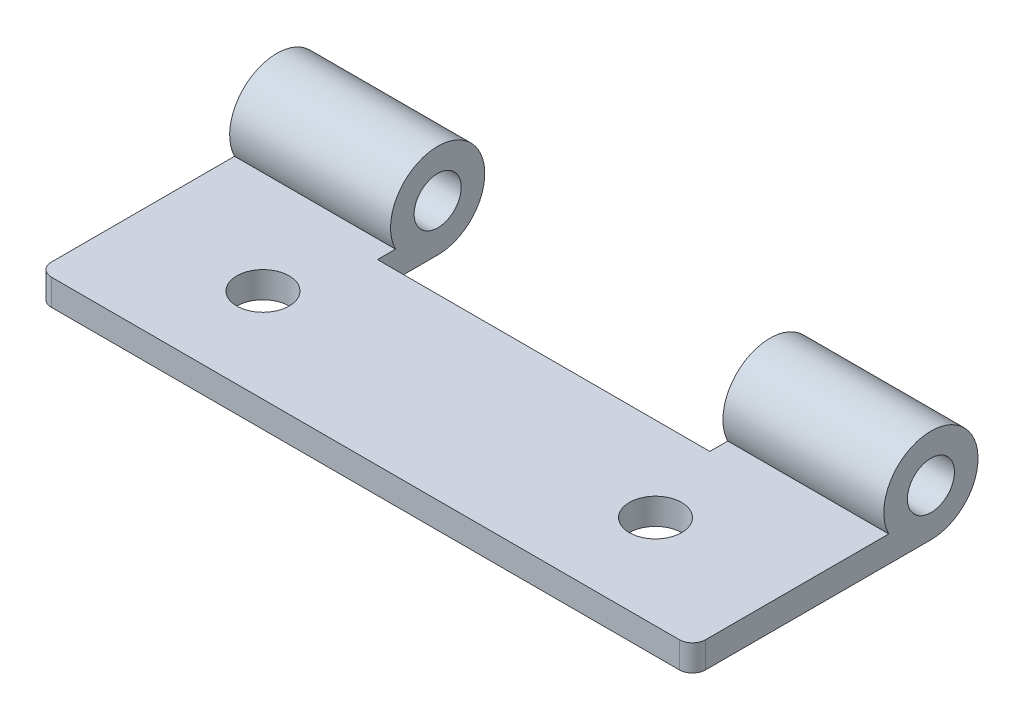
ISO-10303-21;
HEADER;
FILE_DESCRIPTION(('STEP AP214'),'2;1');
FILE_NAME('part.step','',(''),(''),'','','');
FILE_SCHEMA(('AUTOMOTIVE_DESIGN { 1 0 10303 214 1 1 1 1 }'));
ENDSEC;
DATA;
#1=APPLICATION_CONTEXT('core data for automotive mechanical design processes');
#2=APPLICATION_PROTOCOL_DEFINITION('international standard','automotive_design',2000,#1);
#3=PRODUCT_CONTEXT('',#1,'mechanical');
#4=PRODUCT('Part','Part','',(#3));
#5=PRODUCT_RELATED_PRODUCT_CATEGORY('part','',(#4));
#6=PRODUCT_DEFINITION_FORMATION('','',#4);
#7=PRODUCT_DEFINITION_CONTEXT('part definition',#1,'design');
#8=PRODUCT_DEFINITION('design','',#6,#7);
#9=PRODUCT_DEFINITION_SHAPE('','',#8);
#10=(LENGTH_UNIT() NAMED_UNIT(*) SI_UNIT(.MILLI.,.METRE.));
#11=(NAMED_UNIT(*) PLANE_ANGLE_UNIT() SI_UNIT($,.RADIAN.));
#12=(NAMED_UNIT(*) SI_UNIT($,.STERADIAN.) SOLID_ANGLE_UNIT());
#13=UNCERTAINTY_MEASURE_WITH_UNIT(LENGTH_MEASURE(1.E-05),#10,'distance_accuracy_value','');
#14=(GEOMETRIC_REPRESENTATION_CONTEXT(3) GLOBAL_UNCERTAINTY_ASSIGNED_CONTEXT((#13)) GLOBAL_UNIT_ASSIGNED_CONTEXT((#10,
#11,#12)) REPRESENTATION_CONTEXT('',''));
#15=CARTESIAN_POINT('',(0.,0.,0.));
#16=DIRECTION('',(0.,0.,1.));
#17=DIRECTION('',(1.,0.,0.));
#18=AXIS2_PLACEMENT_3D('',#15,#16,#17);
#19=CARTESIAN_POINT('',(25.,-0.800000000000001,9.11245154965971));
#20=DIRECTION('',(0.,-1.,0.));
#21=DIRECTION('',(0.,0.,-1.));
#22=AXIS2_PLACEMENT_3D('',#19,#20,#21);
#23=PLANE('',#22);
#24=CARTESIAN_POINT('',(20.,-0.800000000000002,5.52599178161175));
#25=DIRECTION('',(0.,-1.,0.));
#26=DIRECTION('',(0.,0.,-1.));
#27=AXIS2_PLACEMENT_3D('',#24,#25,#26);
#28=CIRCLE('',#27,0.999999999999998);
#29=CARTESIAN_POINT('',(20.,-0.800000000000002,4.52599178161175));
#30=VERTEX_POINT('',#29);
#31=EDGE_CURVE('E208',#30,#30,#28,.T.);
#32=ORIENTED_EDGE('',*,*,#31,.T.);
#33=EDGE_LOOP('',(#32));
#34=FACE_BOUND('',#33,.T.);
#35=DIRECTION('',(0.,0.,1.));
#36=VECTOR('',#35,1.);
#37=CARTESIAN_POINT('',(0.,-0.800000000000001,9.11245154965971));
#38=LINE('',#37,#36);
#39=CARTESIAN_POINT('',(0.,-0.800000000000001,1.61245154965971));
#40=VERTEX_POINT('',#39);
#41=CARTESIAN_POINT('',(0.,-0.800000000000001,8.61245154965971));
#42=VERTEX_POINT('',#41);
#43=EDGE_CURVE('E169',#40,#42,#38,.T.);
#44=ORIENTED_EDGE('',*,*,#43,.T.);
#45=CARTESIAN_POINT('',(0.5,-0.800000000000001,8.61245154965971));
#46=DIRECTION('',(0.,-1.,0.));
#47=DIRECTION('',(0.,0.,-1.));
#48=AXIS2_PLACEMENT_3D('',#45,#46,#47);
#49=CIRCLE('',#48,0.5);
#50=CARTESIAN_POINT('',(0.5,-0.800000000000001,9.11245154965971));
#51=VERTEX_POINT('',#50);
#52=EDGE_CURVE('E54',#42,#51,#49,.F.);
#53=ORIENTED_EDGE('',*,*,#52,.T.);
#54=DIRECTION('',(-1.,0.,0.));
#55=VECTOR('',#54,1.);
#56=CARTESIAN_POINT('',(25.,-0.800000000000001,9.11245154965971));
#57=LINE('',#56,#55);
#58=CARTESIAN_POINT('',(24.5,-0.800000000000001,9.11245154965971));
#59=VERTEX_POINT('',#58);
#60=EDGE_CURVE('E178',#59,#51,#57,.T.);
#61=ORIENTED_EDGE('',*,*,#60,.F.);
#62=CARTESIAN_POINT('',(24.5,-0.800000000000001,8.61245154965971));
#63=DIRECTION('',(0.,-1.,0.));
#64=DIRECTION('',(0.,0.,-1.));
#65=AXIS2_PLACEMENT_3D('',#62,#63,#64);
#66=CIRCLE('',#65,0.5);
#67=CARTESIAN_POINT('',(25.,-0.800000000000001,8.61245154965971));
#68=VERTEX_POINT('',#67);
#69=EDGE_CURVE('E62',#59,#68,#66,.F.);
#70=ORIENTED_EDGE('',*,*,#69,.T.);
#71=DIRECTION('',(0.,0.,1.));
#72=VECTOR('',#71,1.);
#73=CARTESIAN_POINT('',(25.,-0.800000000000001,9.11245154965971));
#74=LINE('',#73,#72);
#75=CARTESIAN_POINT('',(25.,-0.800000000000001,1.61245154965971));
#76=VERTEX_POINT('',#75);
#77=EDGE_CURVE('E161',#76,#68,#74,.T.);
#78=ORIENTED_EDGE('',*,*,#77,.F.);
#79=DIRECTION('',(-1.,0.,0.));
#80=VECTOR('',#79,1.);
#81=CARTESIAN_POINT('',(25.,-0.800000000000001,1.61245154965971));
#82=LINE('',#81,#80);
#83=CARTESIAN_POINT('',(18.85,-0.800000000000001,1.61245154965971));
#84=VERTEX_POINT('',#83);
#85=EDGE_CURVE('E182',#76,#84,#82,.T.);
#86=ORIENTED_EDGE('',*,*,#85,.T.);
#87=DIRECTION('',(0.,0.,1.));
#88=VECTOR('',#87,1.);
#89=CARTESIAN_POINT('',(18.85,-0.800000000000001,9.11245154965971));
#90=LINE('',#89,#88);
#91=CARTESIAN_POINT('',(18.85,-0.800000000000002,2.3));
#92=VERTEX_POINT('',#91);
#93=EDGE_CURVE('E149',#84,#92,#90,.T.);
#94=ORIENTED_EDGE('',*,*,#93,.T.);
#95=DIRECTION('',(1.,0.,0.));
#96=VECTOR('',#95,1.);
#97=CARTESIAN_POINT('',(25.,-0.800000000000001,2.3));
#98=LINE('',#97,#96);
#99=CARTESIAN_POINT('',(6.15,-0.800000000000002,2.3));
#100=VERTEX_POINT('',#99);
#101=EDGE_CURVE('E140',#100,#92,#98,.T.);
#102=ORIENTED_EDGE('',*,*,#101,.F.);
#103=DIRECTION('',(0.,0.,1.));
#104=VECTOR('',#103,1.);
#105=CARTESIAN_POINT('',(6.15,-0.800000000000001,9.11245154965971));
#106=LINE('',#105,#104);
#107=CARTESIAN_POINT('',(6.15,-0.800000000000001,1.61245154965971));
#108=VERTEX_POINT('',#107);
#109=EDGE_CURVE('E127',#108,#100,#106,.T.);
#110=ORIENTED_EDGE('',*,*,#109,.F.);
#111=EDGE_CURVE('E181',#108,#40,#82,.T.);
#112=ORIENTED_EDGE('',*,*,#111,.T.);
#113=EDGE_LOOP('',(#44,#53,#61,#70,#78,#86,#94,#102,#110,#112));
#114=FACE_BOUND('',#113,.T.);
#115=CARTESIAN_POINT('',(5.,-0.800000000000002,5.52599178161175));
#116=DIRECTION('',(0.,-1.,0.));
#117=DIRECTION('',(0.,0.,-1.));
#118=AXIS2_PLACEMENT_3D('',#115,#116,#117);
#119=CIRCLE('',#118,1.);
#120=CARTESIAN_POINT('',(5.,-0.800000000000002,4.52599178161175));
#121=VERTEX_POINT('',#120);
#122=EDGE_CURVE('E216',#121,#121,#119,.F.);
#123=ORIENTED_EDGE('',*,*,#122,.F.);
#124=EDGE_LOOP('',(#123));
#125=FACE_BOUND('',#124,.T.);
#126=ADVANCED_FACE('F45',(#34,#114,#125),#23,.F.);
#127=CARTESIAN_POINT('',(25.,-1.8,0.));
#128=DIRECTION('',(0.,1.,0.));
#129=DIRECTION('',(0.,0.,1.));
#130=AXIS2_PLACEMENT_3D('',#127,#128,#129);
#131=PLANE('',#130);
#132=CARTESIAN_POINT('',(20.,-1.8,5.52599178161175));
#133=DIRECTION('',(0.,1.,0.));
#134=DIRECTION('',(0.,0.,1.));
#135=AXIS2_PLACEMENT_3D('',#132,#133,#134);
#136=CIRCLE('',#135,0.999999999999998);
#137=CARTESIAN_POINT('',(20.,-1.8,6.52599178161175));
#138=VERTEX_POINT('',#137);
#139=EDGE_CURVE('E206',#138,#138,#136,.T.);
#140=ORIENTED_EDGE('',*,*,#139,.T.);
#141=EDGE_LOOP('',(#140));
#142=FACE_BOUND('',#141,.T.);
#143=DIRECTION('',(-1.,0.,0.));
#144=VECTOR('',#143,1.);
#145=CARTESIAN_POINT('',(25.,-1.8,9.11245154965971));
#146=LINE('',#145,#144);
#147=CARTESIAN_POINT('',(24.5,-1.8,9.11245154965971));
#148=VERTEX_POINT('',#147);
#149=CARTESIAN_POINT('',(0.5,-1.8,9.11245154965971));
#150=VERTEX_POINT('',#149);
#151=EDGE_CURVE('E175',#148,#150,#146,.T.);
#152=ORIENTED_EDGE('',*,*,#151,.T.);
#153=CARTESIAN_POINT('',(0.5,-1.8,8.61245154965971));
#154=DIRECTION('',(0.,1.,0.));
#155=DIRECTION('',(0.,0.,1.));
#156=AXIS2_PLACEMENT_3D('',#153,#154,#155);
#157=CIRCLE('',#156,0.5);
#158=CARTESIAN_POINT('',(0.,-1.8,8.61245154965971));
#159=VERTEX_POINT('',#158);
#160=EDGE_CURVE('E202',#150,#159,#157,.F.);
#161=ORIENTED_EDGE('',*,*,#160,.T.);
#162=DIRECTION('',(0.,0.,-1.));
#163=VECTOR('',#162,1.);
#164=CARTESIAN_POINT('',(0.,-1.8,0.));
#165=LINE('',#164,#163);
#166=CARTESIAN_POINT('',(0.,-1.8,0.));
#167=VERTEX_POINT('',#166);
#168=EDGE_CURVE('E162',#159,#167,#165,.T.);
#169=ORIENTED_EDGE('',*,*,#168,.T.);
#170=DIRECTION('',(-1.,0.,0.));
#171=VECTOR('',#170,1.);
#172=CARTESIAN_POINT('',(25.,-1.8,0.));
#173=LINE('',#172,#171);
#174=CARTESIAN_POINT('',(6.15,-1.8,0.));
#175=VERTEX_POINT('',#174);
#176=EDGE_CURVE('E166',#175,#167,#173,.T.);
#177=ORIENTED_EDGE('',*,*,#176,.F.);
#178=DIRECTION('',(0.,0.,-1.));
#179=VECTOR('',#178,1.);
#180=CARTESIAN_POINT('',(6.15,-1.8,0.));
#181=LINE('',#180,#179);
#182=CARTESIAN_POINT('',(6.15,-1.8,2.3));
#183=VERTEX_POINT('',#182);
#184=EDGE_CURVE('E185',#183,#175,#181,.T.);
#185=ORIENTED_EDGE('',*,*,#184,.F.);
#186=DIRECTION('',(-1.,0.,0.));
#187=VECTOR('',#186,1.);
#188=CARTESIAN_POINT('',(25.,-1.8,2.3));
#189=LINE('',#188,#187);
#190=CARTESIAN_POINT('',(18.85,-1.8,2.3));
#191=VERTEX_POINT('',#190);
#192=EDGE_CURVE('E143',#191,#183,#189,.T.);
#193=ORIENTED_EDGE('',*,*,#192,.F.);
#194=DIRECTION('',(0.,0.,-1.));
#195=VECTOR('',#194,1.);
#196=CARTESIAN_POINT('',(18.85,-1.8,0.));
#197=LINE('',#196,#195);
#198=CARTESIAN_POINT('',(18.85,-1.8,0.));
#199=VERTEX_POINT('',#198);
#200=EDGE_CURVE('E187',#191,#199,#197,.T.);
#201=ORIENTED_EDGE('',*,*,#200,.T.);
#202=CARTESIAN_POINT('',(25.,-1.8,0.));
#203=VERTEX_POINT('',#202);
#204=EDGE_CURVE('E172',#203,#199,#173,.T.);
#205=ORIENTED_EDGE('',*,*,#204,.F.);
#206=DIRECTION('',(0.,0.,-1.));
#207=VECTOR('',#206,1.);
#208=CARTESIAN_POINT('',(25.,-1.8,0.));
#209=LINE('',#208,#207);
#210=CARTESIAN_POINT('',(25.,-1.8,8.61245154965971));
#211=VERTEX_POINT('',#210);
#212=EDGE_CURVE('E164',#211,#203,#209,.T.);
#213=ORIENTED_EDGE('',*,*,#212,.F.);
#214=CARTESIAN_POINT('',(24.5,-1.8,8.61245154965971));
#215=DIRECTION('',(0.,1.,0.));
#216=DIRECTION('',(0.,0.,1.));
#217=AXIS2_PLACEMENT_3D('',#214,#215,#216);
#218=CIRCLE('',#217,0.5);
#219=EDGE_CURVE('E200',#211,#148,#218,.F.);
#220=ORIENTED_EDGE('',*,*,#219,.T.);
#221=EDGE_LOOP('',(#152,#161,#169,#177,#185,#193,#201,#205,#213,#220));
#222=FACE_BOUND('',#221,.T.);
#223=CARTESIAN_POINT('',(5.,-1.8,5.52599178161175));
#224=DIRECTION('',(0.,1.,0.));
#225=DIRECTION('',(0.,0.,1.));
#226=AXIS2_PLACEMENT_3D('',#223,#224,#225);
#227=CIRCLE('',#226,1.);
#228=CARTESIAN_POINT('',(5.,-1.8,6.52599178161175));
#229=VERTEX_POINT('',#228);
#230=EDGE_CURVE('E49',#229,#229,#227,.F.);
#231=ORIENTED_EDGE('',*,*,#230,.F.);
#232=EDGE_LOOP('',(#231));
#233=FACE_BOUND('',#232,.T.);
#234=ADVANCED_FACE('F231',(#142,#222,#233),#131,.F.);
#235=CARTESIAN_POINT('',(25.,0.,0.));
#236=DIRECTION('',(-1.,0.,0.));
#237=DIRECTION('',(0.,0.,1.));
#238=AXIS2_PLACEMENT_3D('',#235,#236,#237);
#239=CYLINDRICAL_SURFACE('',#238,1.8);
#240=CARTESIAN_POINT('',(6.15,0.,0.));
#241=DIRECTION('',(1.,0.,0.));
#242=DIRECTION('',(0.,0.,-1.));
#243=AXIS2_PLACEMENT_3D('',#240,#241,#242);
#244=CIRCLE('',#243,1.8);
#245=EDGE_CURVE('E133',#175,#108,#244,.T.);
#246=ORIENTED_EDGE('',*,*,#245,.F.);
#247=ORIENTED_EDGE('',*,*,#176,.T.);
#248=CARTESIAN_POINT('',(0.,0.,0.));
#249=DIRECTION('',(1.,0.,0.));
#250=DIRECTION('',(0.,0.,-1.));
#251=AXIS2_PLACEMENT_3D('',#248,#249,#250);
#252=CIRCLE('',#251,1.8);
#253=EDGE_CURVE('E157',#167,#40,#252,.T.);
#254=ORIENTED_EDGE('',*,*,#253,.T.);
#255=ORIENTED_EDGE('',*,*,#111,.F.);
#256=EDGE_LOOP('',(#246,#247,#254,#255));
#257=FACE_BOUND('',#256,.T.);
#258=ADVANCED_FACE('F236',(#257),#239,.T.);
#259=ORIENTED_EDGE('',*,*,#204,.T.);
#260=CARTESIAN_POINT('',(18.85,0.,0.));
#261=DIRECTION('',(1.,0.,0.));
#262=DIRECTION('',(0.,0.,-1.));
#263=AXIS2_PLACEMENT_3D('',#260,#261,#262);
#264=CIRCLE('',#263,1.8);
#265=EDGE_CURVE('E136',#199,#84,#264,.T.);
#266=ORIENTED_EDGE('',*,*,#265,.T.);
#267=ORIENTED_EDGE('',*,*,#85,.F.);
#268=CARTESIAN_POINT('',(25.,0.,0.));
#269=DIRECTION('',(1.,0.,0.));
#270=DIRECTION('',(0.,0.,-1.));
#271=AXIS2_PLACEMENT_3D('',#268,#269,#270);
#272=CIRCLE('',#271,1.8);
#273=EDGE_CURVE('E158',#203,#76,#272,.T.);
#274=ORIENTED_EDGE('',*,*,#273,.F.);
#275=EDGE_LOOP('',(#259,#266,#267,#274));
#276=FACE_BOUND('',#275,.T.);
#277=ADVANCED_FACE('F255',(#276),#239,.T.);
#278=CARTESIAN_POINT('',(25.,-1.8,9.11245154965971));
#279=DIRECTION('',(0.,0.,-1.));
#280=DIRECTION('',(-1.,0.,0.));
#281=AXIS2_PLACEMENT_3D('',#278,#279,#280);
#282=PLANE('',#281);
#283=ORIENTED_EDGE('',*,*,#60,.T.);
#284=DIRECTION('',(0.,-1.,0.));
#285=VECTOR('',#284,1.);
#286=CARTESIAN_POINT('',(0.5,-1.8,9.11245154965971));
#287=LINE('',#286,#285);
#288=EDGE_CURVE('E197',#51,#150,#287,.T.);
#289=ORIENTED_EDGE('',*,*,#288,.T.);
#290=ORIENTED_EDGE('',*,*,#151,.F.);
#291=DIRECTION('',(0.,-1.,0.));
#292=VECTOR('',#291,1.);
#293=CARTESIAN_POINT('',(24.5,-0.800000000000001,9.11245154965971));
#294=LINE('',#293,#292);
#295=EDGE_CURVE('E190',#148,#59,#294,.F.);
#296=ORIENTED_EDGE('',*,*,#295,.T.);
#297=EDGE_LOOP('',(#283,#289,#290,#296));
#298=FACE_BOUND('',#297,.T.);
#299=ADVANCED_FACE('F244',(#298),#282,.F.);
#300=CARTESIAN_POINT('',(25.,0.,0.));
#301=DIRECTION('',(1.,0.,0.));
#302=DIRECTION('',(0.,0.,-1.));
#303=AXIS2_PLACEMENT_3D('',#300,#301,#302);
#304=PLANE('',#303);
#305=CARTESIAN_POINT('',(25.,0.,0.));
#306=DIRECTION('',(1.,0.,0.));
#307=DIRECTION('',(0.,0.,-1.));
#308=AXIS2_PLACEMENT_3D('',#305,#306,#307);
#309=CIRCLE('',#308,0.9);
#310=CARTESIAN_POINT('',(25.,0.,-0.9));
#311=VERTEX_POINT('',#310);
#312=EDGE_CURVE('E220',#311,#311,#309,.T.);
#313=ORIENTED_EDGE('',*,*,#312,.F.);
#314=EDGE_LOOP('',(#313));
#315=FACE_BOUND('',#314,.T.);
#316=ORIENTED_EDGE('',*,*,#77,.T.);
#317=DIRECTION('',(0.,-1.,0.));
#318=VECTOR('',#317,1.);
#319=CARTESIAN_POINT('',(25.,-1.8,8.61245154965971));
#320=LINE('',#319,#318);
#321=EDGE_CURVE('E11',#68,#211,#320,.T.);
#322=ORIENTED_EDGE('',*,*,#321,.T.);
#323=ORIENTED_EDGE('',*,*,#212,.T.);
#324=ORIENTED_EDGE('',*,*,#273,.T.);
#325=EDGE_LOOP('',(#316,#322,#323,#324));
#326=FACE_BOUND('',#325,.T.);
#327=ADVANCED_FACE('F251',(#315,#326),#304,.T.);
#328=CARTESIAN_POINT('',(0.,0.,0.));
#329=DIRECTION('',(1.,0.,0.));
#330=DIRECTION('',(0.,0.,-1.));
#331=AXIS2_PLACEMENT_3D('',#328,#329,#330);
#332=PLANE('',#331);
#333=CARTESIAN_POINT('',(0.,0.,0.));
#334=DIRECTION('',(1.,0.,0.));
#335=DIRECTION('',(0.,0.,-1.));
#336=AXIS2_PLACEMENT_3D('',#333,#334,#335);
#337=CIRCLE('',#336,0.9);
#338=CARTESIAN_POINT('',(0.,0.,-0.9));
#339=VERTEX_POINT('',#338);
#340=EDGE_CURVE('E195',#339,#339,#337,.T.);
#341=ORIENTED_EDGE('',*,*,#340,.T.);
#342=EDGE_LOOP('',(#341));
#343=FACE_BOUND('',#342,.T.);
#344=ORIENTED_EDGE('',*,*,#168,.F.);
#345=DIRECTION('',(0.,-1.,0.));
#346=VECTOR('',#345,1.);
#347=CARTESIAN_POINT('',(0.,0.,8.61245154965971));
#348=LINE('',#347,#346);
#349=EDGE_CURVE('E70',#159,#42,#348,.F.);
#350=ORIENTED_EDGE('',*,*,#349,.T.);
#351=ORIENTED_EDGE('',*,*,#43,.F.);
#352=ORIENTED_EDGE('',*,*,#253,.F.);
#353=EDGE_LOOP('',(#344,#350,#351,#352));
#354=FACE_BOUND('',#353,.T.);
#355=ADVANCED_FACE('F239',(#343,#354),#332,.F.);
#356=CARTESIAN_POINT('',(18.85,25.,0.));
#357=DIRECTION('',(1.,0.,0.));
#358=DIRECTION('',(0.,0.,-1.));
#359=AXIS2_PLACEMENT_3D('',#356,#357,#358);
#360=PLANE('',#359);
#361=CARTESIAN_POINT('',(18.85,0.,0.));
#362=DIRECTION('',(1.,0.,0.));
#363=DIRECTION('',(0.,0.,-1.));
#364=AXIS2_PLACEMENT_3D('',#361,#362,#363);
#365=CIRCLE('',#364,0.9);
#366=CARTESIAN_POINT('',(18.85,0.,-0.9));
#367=VERTEX_POINT('',#366);
#368=EDGE_CURVE('E194',#367,#367,#365,.T.);
#369=ORIENTED_EDGE('',*,*,#368,.T.);
#370=EDGE_LOOP('',(#369));
#371=FACE_BOUND('',#370,.T.);
#372=ORIENTED_EDGE('',*,*,#265,.F.);
#373=ORIENTED_EDGE('',*,*,#200,.F.);
#374=DIRECTION('',(0.,-1.,0.));
#375=VECTOR('',#374,1.);
#376=CARTESIAN_POINT('',(18.85,25.,2.3));
#377=LINE('',#376,#375);
#378=EDGE_CURVE('E144',#92,#191,#377,.T.);
#379=ORIENTED_EDGE('',*,*,#378,.F.);
#380=ORIENTED_EDGE('',*,*,#93,.F.);
#381=EDGE_LOOP('',(#372,#373,#379,#380));
#382=FACE_BOUND('',#381,.T.);
#383=ADVANCED_FACE('F228',(#371,#382),#360,.F.);
#384=CARTESIAN_POINT('',(6.15,25.,0.));
#385=DIRECTION('',(1.,0.,0.));
#386=DIRECTION('',(0.,0.,-1.));
#387=AXIS2_PLACEMENT_3D('',#384,#385,#386);
#388=PLANE('',#387);
#389=CARTESIAN_POINT('',(6.15,0.,0.));
#390=DIRECTION('',(1.,0.,0.));
#391=DIRECTION('',(0.,0.,-1.));
#392=AXIS2_PLACEMENT_3D('',#389,#390,#391);
#393=CIRCLE('',#392,0.9);
#394=CARTESIAN_POINT('',(6.15,0.,-0.9));
#395=VERTEX_POINT('',#394);
#396=EDGE_CURVE('E191',#395,#395,#393,.T.);
#397=ORIENTED_EDGE('',*,*,#396,.F.);
#398=EDGE_LOOP('',(#397));
#399=FACE_BOUND('',#398,.T.);
#400=ORIENTED_EDGE('',*,*,#109,.T.);
#401=DIRECTION('',(0.,-1.,0.));
#402=VECTOR('',#401,1.);
#403=CARTESIAN_POINT('',(6.15,25.,2.3));
#404=LINE('',#403,#402);
#405=EDGE_CURVE('E130',#100,#183,#404,.T.);
#406=ORIENTED_EDGE('',*,*,#405,.T.);
#407=ORIENTED_EDGE('',*,*,#184,.T.);
#408=ORIENTED_EDGE('',*,*,#245,.T.);
#409=EDGE_LOOP('',(#400,#406,#407,#408));
#410=FACE_BOUND('',#409,.T.);
#411=ADVANCED_FACE('F129',(#399,#410),#388,.T.);
#412=CARTESIAN_POINT('',(0.,25.,2.3));
#413=DIRECTION('',(0.,0.,-1.));
#414=DIRECTION('',(-1.,0.,0.));
#415=AXIS2_PLACEMENT_3D('',#412,#413,#414);
#416=PLANE('',#415);
#417=ORIENTED_EDGE('',*,*,#101,.T.);
#418=ORIENTED_EDGE('',*,*,#378,.T.);
#419=ORIENTED_EDGE('',*,*,#192,.T.);
#420=ORIENTED_EDGE('',*,*,#405,.F.);
#421=EDGE_LOOP('',(#417,#418,#419,#420));
#422=FACE_BOUND('',#421,.T.);
#423=ADVANCED_FACE('F139',(#422),#416,.T.);
#424=CARTESIAN_POINT('',(0.,0.,0.));
#425=DIRECTION('',(1.,0.,0.));
#426=DIRECTION('',(0.,0.,-1.));
#427=AXIS2_PLACEMENT_3D('',#424,#425,#426);
#428=CYLINDRICAL_SURFACE('',#427,0.9);
#429=ORIENTED_EDGE('',*,*,#396,.T.);
#430=EDGE_LOOP('',(#429));
#431=FACE_BOUND('',#430,.T.);
#432=ORIENTED_EDGE('',*,*,#340,.F.);
#433=EDGE_LOOP('',(#432));
#434=FACE_BOUND('',#433,.T.);
#435=ADVANCED_FACE('F285',(#431,#434),#428,.F.);
#436=ORIENTED_EDGE('',*,*,#312,.T.);
#437=EDGE_LOOP('',(#436));
#438=FACE_BOUND('',#437,.T.);
#439=ORIENTED_EDGE('',*,*,#368,.F.);
#440=EDGE_LOOP('',(#439));
#441=FACE_BOUND('',#440,.T.);
#442=ADVANCED_FACE('F288',(#438,#441),#428,.F.);
#443=CARTESIAN_POINT('',(0.5,-1.8,8.61245154965971));
#444=DIRECTION('',(0.,-1.,0.));
#445=DIRECTION('',(0.,0.,-1.));
#446=AXIS2_PLACEMENT_3D('',#443,#444,#445);
#447=CYLINDRICAL_SURFACE('',#446,0.5);
#448=ORIENTED_EDGE('',*,*,#52,.F.);
#449=ORIENTED_EDGE('',*,*,#349,.F.);
#450=ORIENTED_EDGE('',*,*,#160,.F.);
#451=ORIENTED_EDGE('',*,*,#288,.F.);
#452=EDGE_LOOP('',(#448,#449,#450,#451));
#453=FACE_BOUND('',#452,.T.);
#454=ADVANCED_FACE('F241',(#453),#447,.T.);
#455=CARTESIAN_POINT('',(24.5,0.,8.61245154965971));
#456=DIRECTION('',(0.,1.,0.));
#457=DIRECTION('',(0.,0.,1.));
#458=AXIS2_PLACEMENT_3D('',#455,#456,#457);
#459=CYLINDRICAL_SURFACE('',#458,0.5);
#460=ORIENTED_EDGE('',*,*,#69,.F.);
#461=ORIENTED_EDGE('',*,*,#295,.F.);
#462=ORIENTED_EDGE('',*,*,#219,.F.);
#463=ORIENTED_EDGE('',*,*,#321,.F.);
#464=EDGE_LOOP('',(#460,#461,#462,#463));
#465=FACE_BOUND('',#464,.T.);
#466=ADVANCED_FACE('F47',(#465),#459,.T.);
#467=CARTESIAN_POINT('',(20.,25.,5.52599178161175));
#468=DIRECTION('',(0.,-1.,0.));
#469=DIRECTION('',(0.,0.,-1.));
#470=AXIS2_PLACEMENT_3D('',#467,#468,#469);
#471=CYLINDRICAL_SURFACE('',#470,0.999999999999998);
#472=ORIENTED_EDGE('',*,*,#139,.F.);
#473=EDGE_LOOP('',(#472));
#474=FACE_BOUND('',#473,.T.);
#475=ORIENTED_EDGE('',*,*,#31,.F.);
#476=EDGE_LOOP('',(#475));
#477=FACE_BOUND('',#476,.T.);
#478=ADVANCED_FACE('F290',(#474,#477),#471,.F.);
#479=CARTESIAN_POINT('',(5.,25.,5.52599178161175));
#480=DIRECTION('',(0.,-1.,0.));
#481=DIRECTION('',(0.,0.,-1.));
#482=AXIS2_PLACEMENT_3D('',#479,#480,#481);
#483=CYLINDRICAL_SURFACE('',#482,1.);
#484=ORIENTED_EDGE('',*,*,#230,.T.);
#485=EDGE_LOOP('',(#484));
#486=FACE_BOUND('',#485,.T.);
#487=ORIENTED_EDGE('',*,*,#122,.T.);
#488=EDGE_LOOP('',(#487));
#489=FACE_BOUND('',#488,.T.);
#490=ADVANCED_FACE('F293',(#486,#489),#483,.F.);
#491=CLOSED_SHELL('',(#126,#234,#258,#277,#299,#327,#355,#383,#411,#423,#435,#442,#454,#466,
#478,#490));
#492=MANIFOLD_SOLID_BREP('B2',#491);
#493=ADVANCED_BREP_SHAPE_REPRESENTATION('',(#18,#492),#14);
#494=SHAPE_DEFINITION_REPRESENTATION(#9,#493);
ENDSEC;
END-ISO-10303-21;
